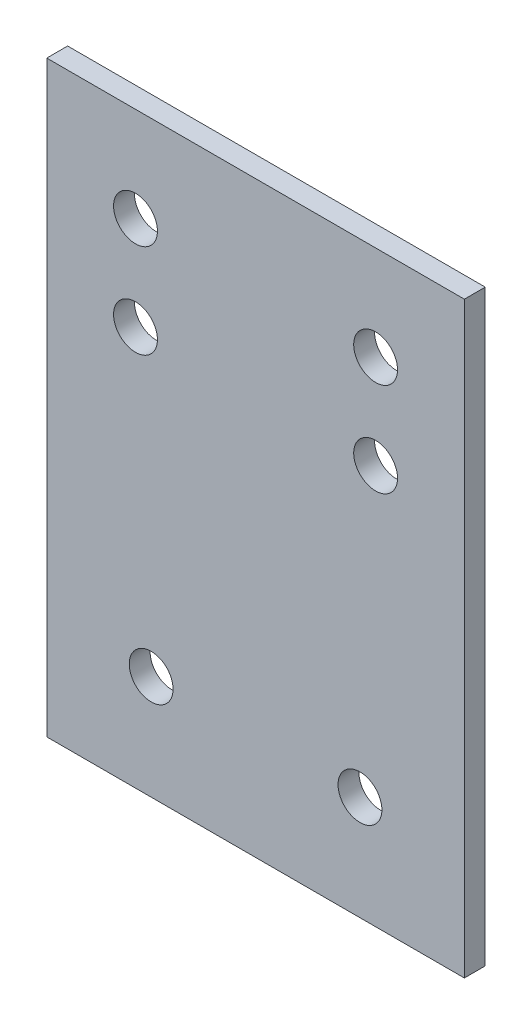
ISO-10303-21;
HEADER;
FILE_DESCRIPTION(('STEP AP214'),'2;1');
FILE_NAME('part.step','',(''),(''),'','','');
FILE_SCHEMA(('AUTOMOTIVE_DESIGN { 1 0 10303 214 1 1 1 1 }'));
ENDSEC;
DATA;
#1=APPLICATION_CONTEXT('core data for automotive mechanical design processes');
#2=APPLICATION_PROTOCOL_DEFINITION('international standard','automotive_design',2000,#1);
#3=PRODUCT_CONTEXT('',#1,'mechanical');
#4=PRODUCT('Part','Part','',(#3));
#5=PRODUCT_RELATED_PRODUCT_CATEGORY('part','',(#4));
#6=PRODUCT_DEFINITION_FORMATION('','',#4);
#7=PRODUCT_DEFINITION_CONTEXT('part definition',#1,'design');
#8=PRODUCT_DEFINITION('design','',#6,#7);
#9=PRODUCT_DEFINITION_SHAPE('','',#8);
#10=(LENGTH_UNIT() NAMED_UNIT(*) SI_UNIT(.MILLI.,.METRE.));
#11=(NAMED_UNIT(*) PLANE_ANGLE_UNIT() SI_UNIT($,.RADIAN.));
#12=(NAMED_UNIT(*) SI_UNIT($,.STERADIAN.) SOLID_ANGLE_UNIT());
#13=UNCERTAINTY_MEASURE_WITH_UNIT(LENGTH_MEASURE(1.E-05),#10,'distance_accuracy_value','');
#14=(GEOMETRIC_REPRESENTATION_CONTEXT(3) GLOBAL_UNCERTAINTY_ASSIGNED_CONTEXT((#13)) GLOBAL_UNIT_ASSIGNED_CONTEXT((#10,
#11,#12)) REPRESENTATION_CONTEXT('',''));
#15=CARTESIAN_POINT('',(0.,0.,0.));
#16=DIRECTION('',(0.,0.,1.));
#17=DIRECTION('',(1.,0.,0.));
#18=AXIS2_PLACEMENT_3D('',#15,#16,#17);
#19=CARTESIAN_POINT('',(-1740.42117355049,-1861.91940911594,4.));
#20=DIRECTION('',(-1.,0.,0.));
#21=DIRECTION('',(0.,0.,1.));
#22=AXIS2_PLACEMENT_3D('',#19,#20,#21);
#23=PLANE('',#22);
#24=DIRECTION('',(0.,1.,0.));
#25=VECTOR('',#24,1.);
#26=CARTESIAN_POINT('',(-1740.42117355049,-1861.91940911594,0.));
#27=LINE('',#26,#25);
#28=CARTESIAN_POINT('',(-1740.42117355049,-1861.91940911594,0.));
#29=VERTEX_POINT('',#28);
#30=CARTESIAN_POINT('',(-1740.42117355049,-1749.29578657344,0.));
#31=VERTEX_POINT('',#30);
#32=EDGE_CURVE('E96',#29,#31,#27,.T.);
#33=ORIENTED_EDGE('',*,*,#32,.T.);
#34=DIRECTION('',(0.,0.,-1.));
#35=VECTOR('',#34,1.);
#36=CARTESIAN_POINT('',(-1740.42117355049,-1749.29578657344,4.));
#37=LINE('',#36,#35);
#38=CARTESIAN_POINT('',(-1740.42117355049,-1749.29578657344,4.));
#39=VERTEX_POINT('',#38);
#40=EDGE_CURVE('E11',#39,#31,#37,.T.);
#41=ORIENTED_EDGE('',*,*,#40,.F.);
#42=DIRECTION('',(0.,1.,0.));
#43=VECTOR('',#42,1.);
#44=CARTESIAN_POINT('',(-1740.42117355049,-1861.91940911594,4.));
#45=LINE('',#44,#43);
#46=CARTESIAN_POINT('',(-1740.42117355049,-1861.91940911594,4.));
#47=VERTEX_POINT('',#46);
#48=EDGE_CURVE('E84',#47,#39,#45,.T.);
#49=ORIENTED_EDGE('',*,*,#48,.F.);
#50=DIRECTION('',(0.,0.,-1.));
#51=VECTOR('',#50,1.);
#52=CARTESIAN_POINT('',(-1740.42117355049,-1861.91940911594,4.));
#53=LINE('',#52,#51);
#54=EDGE_CURVE('E92',#47,#29,#53,.T.);
#55=ORIENTED_EDGE('',*,*,#54,.T.);
#56=EDGE_LOOP('',(#33,#41,#49,#55));
#57=FACE_BOUND('',#56,.T.);
#58=ADVANCED_FACE('F33',(#57),#23,.F.);
#59=CARTESIAN_POINT('',(-1740.42117355049,-1749.29578657344,4.));
#60=DIRECTION('',(0.,-1.,0.));
#61=DIRECTION('',(0.,0.,-1.));
#62=AXIS2_PLACEMENT_3D('',#59,#60,#61);
#63=PLANE('',#62);
#64=DIRECTION('',(-1.,0.,0.));
#65=VECTOR('',#64,1.);
#66=CARTESIAN_POINT('',(-1740.42117355049,-1749.29578657344,0.));
#67=LINE('',#66,#65);
#68=CARTESIAN_POINT('',(-1820.42117355045,-1749.29578657344,0.));
#69=VERTEX_POINT('',#68);
#70=EDGE_CURVE('E88',#31,#69,#67,.T.);
#71=ORIENTED_EDGE('',*,*,#70,.T.);
#72=DIRECTION('',(0.,0.,-1.));
#73=VECTOR('',#72,1.);
#74=CARTESIAN_POINT('',(-1820.42117355045,-1749.29578657344,4.));
#75=LINE('',#74,#73);
#76=CARTESIAN_POINT('',(-1820.42117355045,-1749.29578657344,4.));
#77=VERTEX_POINT('',#76);
#78=EDGE_CURVE('E41',#77,#69,#75,.T.);
#79=ORIENTED_EDGE('',*,*,#78,.F.);
#80=DIRECTION('',(-1.,0.,0.));
#81=VECTOR('',#80,1.);
#82=CARTESIAN_POINT('',(-1740.42117355049,-1749.29578657344,4.));
#83=LINE('',#82,#81);
#84=EDGE_CURVE('E79',#39,#77,#83,.T.);
#85=ORIENTED_EDGE('',*,*,#84,.F.);
#86=ORIENTED_EDGE('',*,*,#40,.T.);
#87=EDGE_LOOP('',(#71,#79,#85,#86));
#88=FACE_BOUND('',#87,.T.);
#89=ADVANCED_FACE('F87',(#88),#63,.F.);
#90=CARTESIAN_POINT('',(-1820.42117355045,-1861.91940911594,4.));
#91=DIRECTION('',(1.,0.,0.));
#92=DIRECTION('',(0.,0.,-1.));
#93=AXIS2_PLACEMENT_3D('',#90,#91,#92);
#94=PLANE('',#93);
#95=DIRECTION('',(0.,-1.,0.));
#96=VECTOR('',#95,1.);
#97=CARTESIAN_POINT('',(-1820.42117355045,-1861.91940911594,0.));
#98=LINE('',#97,#96);
#99=CARTESIAN_POINT('',(-1820.42117355045,-1861.91940911594,0.));
#100=VERTEX_POINT('',#99);
#101=EDGE_CURVE('E66',#69,#100,#98,.T.);
#102=ORIENTED_EDGE('',*,*,#101,.T.);
#103=DIRECTION('',(0.,0.,-1.));
#104=VECTOR('',#103,1.);
#105=CARTESIAN_POINT('',(-1820.42117355045,-1861.91940911594,4.));
#106=LINE('',#105,#104);
#107=CARTESIAN_POINT('',(-1820.42117355045,-1861.91940911594,4.));
#108=VERTEX_POINT('',#107);
#109=EDGE_CURVE('E89',#108,#100,#106,.T.);
#110=ORIENTED_EDGE('',*,*,#109,.F.);
#111=DIRECTION('',(0.,-1.,0.));
#112=VECTOR('',#111,1.);
#113=CARTESIAN_POINT('',(-1820.42117355045,-1861.91940911594,4.));
#114=LINE('',#113,#112);
#115=EDGE_CURVE('E82',#77,#108,#114,.T.);
#116=ORIENTED_EDGE('',*,*,#115,.F.);
#117=ORIENTED_EDGE('',*,*,#78,.T.);
#118=EDGE_LOOP('',(#102,#110,#116,#117));
#119=FACE_BOUND('',#118,.T.);
#120=ADVANCED_FACE('F90',(#119),#94,.F.);
#121=CARTESIAN_POINT('',(-1740.42117355049,-1861.91940911594,4.));
#122=DIRECTION('',(0.,1.,0.));
#123=DIRECTION('',(0.,0.,1.));
#124=AXIS2_PLACEMENT_3D('',#121,#122,#123);
#125=PLANE('',#124);
#126=DIRECTION('',(1.,0.,0.));
#127=VECTOR('',#126,1.);
#128=CARTESIAN_POINT('',(-1740.42117355049,-1861.91940911594,0.));
#129=LINE('',#128,#127);
#130=EDGE_CURVE('E72',#100,#29,#129,.T.);
#131=ORIENTED_EDGE('',*,*,#130,.T.);
#132=ORIENTED_EDGE('',*,*,#54,.F.);
#133=DIRECTION('',(1.,0.,0.));
#134=VECTOR('',#133,1.);
#135=CARTESIAN_POINT('',(-1740.42117355049,-1861.91940911594,4.));
#136=LINE('',#135,#134);
#137=EDGE_CURVE('E49',#108,#47,#136,.T.);
#138=ORIENTED_EDGE('',*,*,#137,.F.);
#139=ORIENTED_EDGE('',*,*,#109,.T.);
#140=EDGE_LOOP('',(#131,#132,#138,#139));
#141=FACE_BOUND('',#140,.T.);
#142=ADVANCED_FACE('F104',(#141),#125,.F.);
#143=CARTESIAN_POINT('',(0.,0.,4.));
#144=DIRECTION('',(0.,0.,1.));
#145=DIRECTION('',(1.,0.,0.));
#146=AXIS2_PLACEMENT_3D('',#143,#144,#145);
#147=PLANE('',#146);
#148=CARTESIAN_POINT('',(-1760.42117355049,-1841.91940911594,4.));
#149=DIRECTION('',(0.,0.,1.));
#150=DIRECTION('',(1.,0.,0.));
#151=AXIS2_PLACEMENT_3D('',#148,#149,#150);
#152=CIRCLE('',#151,4.19999999999998);
#153=CARTESIAN_POINT('',(-1756.22117355049,-1841.91940911594,4.));
#154=VERTEX_POINT('',#153);
#155=EDGE_CURVE('E142',#154,#154,#152,.T.);
#156=ORIENTED_EDGE('',*,*,#155,.F.);
#157=EDGE_LOOP('',(#156));
#158=FACE_BOUND('',#157,.T.);
#159=CARTESIAN_POINT('',(-1803.4211735478,-1767.41940911596,4.));
#160=DIRECTION('',(0.,0.,1.));
#161=DIRECTION('',(1.,0.,0.));
#162=AXIS2_PLACEMENT_3D('',#159,#160,#161);
#163=CIRCLE('',#162,4.19999999999998);
#164=CARTESIAN_POINT('',(-1799.2211735478,-1767.41940911596,4.));
#165=VERTEX_POINT('',#164);
#166=EDGE_CURVE('E136',#165,#165,#163,.T.);
#167=ORIENTED_EDGE('',*,*,#166,.F.);
#168=EDGE_LOOP('',(#167));
#169=FACE_BOUND('',#168,.T.);
#170=CARTESIAN_POINT('',(-1800.42117355048,-1841.91940911595,4.));
#171=DIRECTION('',(0.,0.,1.));
#172=DIRECTION('',(1.,0.,0.));
#173=AXIS2_PLACEMENT_3D('',#170,#171,#172);
#174=CIRCLE('',#173,4.19999999999998);
#175=CARTESIAN_POINT('',(-1796.22117355048,-1841.91940911595,4.));
#176=VERTEX_POINT('',#175);
#177=EDGE_CURVE('E130',#176,#176,#174,.T.);
#178=ORIENTED_EDGE('',*,*,#177,.F.);
#179=EDGE_LOOP('',(#178));
#180=FACE_BOUND('',#179,.T.);
#181=CARTESIAN_POINT('',(-1757.4211735478,-1785.41940911596,4.));
#182=DIRECTION('',(0.,0.,1.));
#183=DIRECTION('',(1.,0.,0.));
#184=AXIS2_PLACEMENT_3D('',#181,#182,#183);
#185=CIRCLE('',#184,4.19999999999998);
#186=CARTESIAN_POINT('',(-1753.2211735478,-1785.41940911596,4.));
#187=VERTEX_POINT('',#186);
#188=EDGE_CURVE('E124',#187,#187,#185,.T.);
#189=ORIENTED_EDGE('',*,*,#188,.F.);
#190=EDGE_LOOP('',(#189));
#191=FACE_BOUND('',#190,.T.);
#192=CARTESIAN_POINT('',(-1757.4211735478,-1767.41940911596,4.));
#193=DIRECTION('',(0.,0.,1.));
#194=DIRECTION('',(1.,0.,0.));
#195=AXIS2_PLACEMENT_3D('',#192,#193,#194);
#196=CIRCLE('',#195,4.19999999999998);
#197=CARTESIAN_POINT('',(-1753.2211735478,-1767.41940911596,4.));
#198=VERTEX_POINT('',#197);
#199=EDGE_CURVE('E118',#198,#198,#196,.T.);
#200=ORIENTED_EDGE('',*,*,#199,.F.);
#201=EDGE_LOOP('',(#200));
#202=FACE_BOUND('',#201,.T.);
#203=CARTESIAN_POINT('',(-1803.4211735478,-1785.41940911596,4.));
#204=DIRECTION('',(0.,0.,1.));
#205=DIRECTION('',(1.,0.,0.));
#206=AXIS2_PLACEMENT_3D('',#203,#204,#205);
#207=CIRCLE('',#206,4.19999999999998);
#208=CARTESIAN_POINT('',(-1799.2211735478,-1785.41940911596,4.));
#209=VERTEX_POINT('',#208);
#210=EDGE_CURVE('E112',#209,#209,#207,.T.);
#211=ORIENTED_EDGE('',*,*,#210,.F.);
#212=EDGE_LOOP('',(#211));
#213=FACE_BOUND('',#212,.T.);
#214=ORIENTED_EDGE('',*,*,#48,.T.);
#215=ORIENTED_EDGE('',*,*,#84,.T.);
#216=ORIENTED_EDGE('',*,*,#115,.T.);
#217=ORIENTED_EDGE('',*,*,#137,.T.);
#218=EDGE_LOOP('',(#214,#215,#216,#217));
#219=FACE_BOUND('',#218,.T.);
#220=ADVANCED_FACE('F80',(#158,#169,#180,#191,#202,#213,#219),#147,.T.);
#221=CARTESIAN_POINT('',(0.,0.,0.));
#222=DIRECTION('',(0.,0.,1.));
#223=DIRECTION('',(1.,0.,0.));
#224=AXIS2_PLACEMENT_3D('',#221,#222,#223);
#225=PLANE('',#224);
#226=CARTESIAN_POINT('',(-1760.42117355049,-1841.91940911594,0.));
#227=DIRECTION('',(0.,0.,1.));
#228=DIRECTION('',(1.,0.,0.));
#229=AXIS2_PLACEMENT_3D('',#226,#227,#228);
#230=CIRCLE('',#229,4.19999999999998);
#231=CARTESIAN_POINT('',(-1756.22117355049,-1841.91940911594,0.));
#232=VERTEX_POINT('',#231);
#233=EDGE_CURVE('E139',#232,#232,#230,.T.);
#234=ORIENTED_EDGE('',*,*,#233,.T.);
#235=EDGE_LOOP('',(#234));
#236=FACE_BOUND('',#235,.T.);
#237=CARTESIAN_POINT('',(-1803.4211735478,-1767.41940911596,0.));
#238=DIRECTION('',(0.,0.,1.));
#239=DIRECTION('',(1.,0.,0.));
#240=AXIS2_PLACEMENT_3D('',#237,#238,#239);
#241=CIRCLE('',#240,4.19999999999998);
#242=CARTESIAN_POINT('',(-1799.2211735478,-1767.41940911596,0.));
#243=VERTEX_POINT('',#242);
#244=EDGE_CURVE('E133',#243,#243,#241,.T.);
#245=ORIENTED_EDGE('',*,*,#244,.T.);
#246=EDGE_LOOP('',(#245));
#247=FACE_BOUND('',#246,.T.);
#248=CARTESIAN_POINT('',(-1800.42117355048,-1841.91940911595,0.));
#249=DIRECTION('',(0.,0.,1.));
#250=DIRECTION('',(1.,0.,0.));
#251=AXIS2_PLACEMENT_3D('',#248,#249,#250);
#252=CIRCLE('',#251,4.19999999999998);
#253=CARTESIAN_POINT('',(-1796.22117355048,-1841.91940911595,0.));
#254=VERTEX_POINT('',#253);
#255=EDGE_CURVE('E127',#254,#254,#252,.T.);
#256=ORIENTED_EDGE('',*,*,#255,.T.);
#257=EDGE_LOOP('',(#256));
#258=FACE_BOUND('',#257,.T.);
#259=CARTESIAN_POINT('',(-1757.4211735478,-1785.41940911596,0.));
#260=DIRECTION('',(0.,0.,1.));
#261=DIRECTION('',(1.,0.,0.));
#262=AXIS2_PLACEMENT_3D('',#259,#260,#261);
#263=CIRCLE('',#262,4.19999999999998);
#264=CARTESIAN_POINT('',(-1753.2211735478,-1785.41940911596,0.));
#265=VERTEX_POINT('',#264);
#266=EDGE_CURVE('E121',#265,#265,#263,.T.);
#267=ORIENTED_EDGE('',*,*,#266,.T.);
#268=EDGE_LOOP('',(#267));
#269=FACE_BOUND('',#268,.T.);
#270=CARTESIAN_POINT('',(-1757.4211735478,-1767.41940911596,0.));
#271=DIRECTION('',(0.,0.,1.));
#272=DIRECTION('',(1.,0.,0.));
#273=AXIS2_PLACEMENT_3D('',#270,#271,#272);
#274=CIRCLE('',#273,4.19999999999998);
#275=CARTESIAN_POINT('',(-1753.2211735478,-1767.41940911596,0.));
#276=VERTEX_POINT('',#275);
#277=EDGE_CURVE('E115',#276,#276,#274,.T.);
#278=ORIENTED_EDGE('',*,*,#277,.T.);
#279=EDGE_LOOP('',(#278));
#280=FACE_BOUND('',#279,.T.);
#281=CARTESIAN_POINT('',(-1803.4211735478,-1785.41940911596,0.));
#282=DIRECTION('',(0.,0.,1.));
#283=DIRECTION('',(1.,0.,0.));
#284=AXIS2_PLACEMENT_3D('',#281,#282,#283);
#285=CIRCLE('',#284,4.19999999999998);
#286=CARTESIAN_POINT('',(-1799.2211735478,-1785.41940911596,0.));
#287=VERTEX_POINT('',#286);
#288=EDGE_CURVE('E99',#287,#287,#285,.T.);
#289=ORIENTED_EDGE('',*,*,#288,.T.);
#290=EDGE_LOOP('',(#289));
#291=FACE_BOUND('',#290,.T.);
#292=ORIENTED_EDGE('',*,*,#32,.F.);
#293=ORIENTED_EDGE('',*,*,#130,.F.);
#294=ORIENTED_EDGE('',*,*,#101,.F.);
#295=ORIENTED_EDGE('',*,*,#70,.F.);
#296=EDGE_LOOP('',(#292,#293,#294,#295));
#297=FACE_BOUND('',#296,.T.);
#298=ADVANCED_FACE('F107',(#236,#247,#258,#269,#280,#291,#297),#225,.F.);
#299=CARTESIAN_POINT('',(-1803.4211735478,-1785.41940911596,4.));
#300=DIRECTION('',(0.,0.,1.));
#301=DIRECTION('',(1.,0.,0.));
#302=AXIS2_PLACEMENT_3D('',#299,#300,#301);
#303=CYLINDRICAL_SURFACE('',#302,4.19999999999998);
#304=ORIENTED_EDGE('',*,*,#288,.F.);
#305=EDGE_LOOP('',(#304));
#306=FACE_BOUND('',#305,.T.);
#307=ORIENTED_EDGE('',*,*,#210,.T.);
#308=EDGE_LOOP('',(#307));
#309=FACE_BOUND('',#308,.T.);
#310=ADVANCED_FACE('F161',(#306,#309),#303,.F.);
#311=CARTESIAN_POINT('',(-1757.4211735478,-1767.41940911596,4.));
#312=DIRECTION('',(0.,0.,1.));
#313=DIRECTION('',(1.,0.,0.));
#314=AXIS2_PLACEMENT_3D('',#311,#312,#313);
#315=CYLINDRICAL_SURFACE('',#314,4.19999999999998);
#316=ORIENTED_EDGE('',*,*,#277,.F.);
#317=EDGE_LOOP('',(#316));
#318=FACE_BOUND('',#317,.T.);
#319=ORIENTED_EDGE('',*,*,#199,.T.);
#320=EDGE_LOOP('',(#319));
#321=FACE_BOUND('',#320,.T.);
#322=ADVANCED_FACE('F163',(#318,#321),#315,.F.);
#323=CARTESIAN_POINT('',(-1757.4211735478,-1785.41940911596,4.));
#324=DIRECTION('',(0.,0.,1.));
#325=DIRECTION('',(1.,0.,0.));
#326=AXIS2_PLACEMENT_3D('',#323,#324,#325);
#327=CYLINDRICAL_SURFACE('',#326,4.19999999999998);
#328=ORIENTED_EDGE('',*,*,#266,.F.);
#329=EDGE_LOOP('',(#328));
#330=FACE_BOUND('',#329,.T.);
#331=ORIENTED_EDGE('',*,*,#188,.T.);
#332=EDGE_LOOP('',(#331));
#333=FACE_BOUND('',#332,.T.);
#334=ADVANCED_FACE('F170',(#330,#333),#327,.F.);
#335=CARTESIAN_POINT('',(-1800.42117355048,-1841.91940911595,4.));
#336=DIRECTION('',(0.,0.,1.));
#337=DIRECTION('',(1.,0.,0.));
#338=AXIS2_PLACEMENT_3D('',#335,#336,#337);
#339=CYLINDRICAL_SURFACE('',#338,4.19999999999998);
#340=ORIENTED_EDGE('',*,*,#255,.F.);
#341=EDGE_LOOP('',(#340));
#342=FACE_BOUND('',#341,.T.);
#343=ORIENTED_EDGE('',*,*,#177,.T.);
#344=EDGE_LOOP('',(#343));
#345=FACE_BOUND('',#344,.T.);
#346=ADVANCED_FACE('F217',(#342,#345),#339,.F.);
#347=CARTESIAN_POINT('',(-1803.4211735478,-1767.41940911596,4.));
#348=DIRECTION('',(0.,0.,1.));
#349=DIRECTION('',(1.,0.,0.));
#350=AXIS2_PLACEMENT_3D('',#347,#348,#349);
#351=CYLINDRICAL_SURFACE('',#350,4.19999999999998);
#352=ORIENTED_EDGE('',*,*,#244,.F.);
#353=EDGE_LOOP('',(#352));
#354=FACE_BOUND('',#353,.T.);
#355=ORIENTED_EDGE('',*,*,#166,.T.);
#356=EDGE_LOOP('',(#355));
#357=FACE_BOUND('',#356,.T.);
#358=ADVANCED_FACE('F227',(#354,#357),#351,.F.);
#359=CARTESIAN_POINT('',(-1760.42117355049,-1841.91940911594,4.));
#360=DIRECTION('',(0.,0.,1.));
#361=DIRECTION('',(1.,0.,0.));
#362=AXIS2_PLACEMENT_3D('',#359,#360,#361);
#363=CYLINDRICAL_SURFACE('',#362,4.19999999999998);
#364=ORIENTED_EDGE('',*,*,#233,.F.);
#365=EDGE_LOOP('',(#364));
#366=FACE_BOUND('',#365,.T.);
#367=ORIENTED_EDGE('',*,*,#155,.T.);
#368=EDGE_LOOP('',(#367));
#369=FACE_BOUND('',#368,.T.);
#370=ADVANCED_FACE('F146',(#366,#369),#363,.F.);
#371=CLOSED_SHELL('',(#58,#89,#120,#142,#220,#298,#310,#322,#334,#346,#358,#370));
#372=MANIFOLD_SOLID_BREP('B2',#371);
#373=ADVANCED_BREP_SHAPE_REPRESENTATION('',(#18,#372),#14);
#374=SHAPE_DEFINITION_REPRESENTATION(#9,#373);
ENDSEC;
END-ISO-10303-21;
